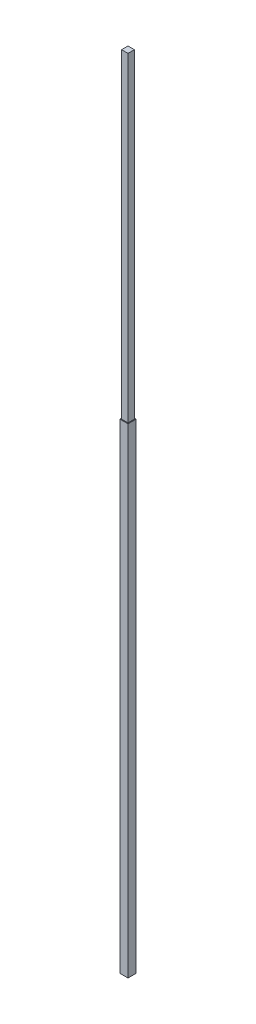
ISO-10303-21;
HEADER;
FILE_DESCRIPTION(('STEP AP214'),'2;1');
FILE_NAME('part.step','',(''),(''),'','','');
FILE_SCHEMA(('AUTOMOTIVE_DESIGN { 1 0 10303 214 1 1 1 1 }'));
ENDSEC;
DATA;
#1=APPLICATION_CONTEXT('core data for automotive mechanical design processes');
#2=APPLICATION_PROTOCOL_DEFINITION('international standard','automotive_design',2000,#1);
#3=PRODUCT_CONTEXT('',#1,'mechanical');
#4=PRODUCT('Part','Part','',(#3));
#5=PRODUCT_RELATED_PRODUCT_CATEGORY('part','',(#4));
#6=PRODUCT_DEFINITION_FORMATION('','',#4);
#7=PRODUCT_DEFINITION_CONTEXT('part definition',#1,'design');
#8=PRODUCT_DEFINITION('design','',#6,#7);
#9=PRODUCT_DEFINITION_SHAPE('','',#8);
#10=(LENGTH_UNIT() NAMED_UNIT(*) SI_UNIT(.MILLI.,.METRE.));
#11=(NAMED_UNIT(*) PLANE_ANGLE_UNIT() SI_UNIT($,.RADIAN.));
#12=(NAMED_UNIT(*) SI_UNIT($,.STERADIAN.) SOLID_ANGLE_UNIT());
#13=UNCERTAINTY_MEASURE_WITH_UNIT(LENGTH_MEASURE(1.E-05),#10,'distance_accuracy_value','');
#14=(GEOMETRIC_REPRESENTATION_CONTEXT(3) GLOBAL_UNCERTAINTY_ASSIGNED_CONTEXT((#13)) GLOBAL_UNIT_ASSIGNED_CONTEXT((#10,
#11,#12)) REPRESENTATION_CONTEXT('',''));
#15=CARTESIAN_POINT('',(0.,0.,0.));
#16=DIRECTION('',(0.,0.,1.));
#17=DIRECTION('',(1.,0.,0.));
#18=AXIS2_PLACEMENT_3D('',#15,#16,#17);
#19=CARTESIAN_POINT('',(22.86,1016.,-22.86));
#20=DIRECTION('',(0.,0.,1.));
#21=DIRECTION('',(1.,0.,0.));
#22=AXIS2_PLACEMENT_3D('',#19,#20,#21);
#23=PLANE('',#22);
#24=DIRECTION('',(-1.,0.,0.));
#25=VECTOR('',#24,1.);
#26=CARTESIAN_POINT('',(22.86,0.,-22.86));
#27=LINE('',#26,#25);
#28=CARTESIAN_POINT('',(22.86,0.,-22.86));
#29=VERTEX_POINT('',#28);
#30=CARTESIAN_POINT('',(2.54,0.,-22.86));
#31=VERTEX_POINT('',#30);
#32=EDGE_CURVE('E111',#29,#31,#27,.T.);
#33=ORIENTED_EDGE('',*,*,#32,.T.);
#34=DIRECTION('',(0.,-1.,0.));
#35=VECTOR('',#34,1.);
#36=CARTESIAN_POINT('',(2.54,1016.,-22.86));
#37=LINE('',#36,#35);
#38=CARTESIAN_POINT('',(2.54,1016.,-22.86));
#39=VERTEX_POINT('',#38);
#40=EDGE_CURVE('E12',#39,#31,#37,.T.);
#41=ORIENTED_EDGE('',*,*,#40,.F.);
#42=DIRECTION('',(-1.,0.,0.));
#43=VECTOR('',#42,1.);
#44=CARTESIAN_POINT('',(22.86,1016.,-22.86));
#45=LINE('',#44,#43);
#46=CARTESIAN_POINT('',(22.86,1016.,-22.86));
#47=VERTEX_POINT('',#46);
#48=EDGE_CURVE('E99',#47,#39,#45,.T.);
#49=ORIENTED_EDGE('',*,*,#48,.F.);
#50=DIRECTION('',(0.,-1.,0.));
#51=VECTOR('',#50,1.);
#52=CARTESIAN_POINT('',(22.86,1016.,-22.86));
#53=LINE('',#52,#51);
#54=EDGE_CURVE('E107',#47,#29,#53,.T.);
#55=ORIENTED_EDGE('',*,*,#54,.T.);
#56=EDGE_LOOP('',(#33,#41,#49,#55));
#57=FACE_BOUND('',#56,.T.);
#58=ADVANCED_FACE('F48',(#57),#23,.F.);
#59=CARTESIAN_POINT('',(2.54,1016.,-22.86));
#60=DIRECTION('',(1.,0.,0.));
#61=DIRECTION('',(0.,0.,-1.));
#62=AXIS2_PLACEMENT_3D('',#59,#60,#61);
#63=PLANE('',#62);
#64=DIRECTION('',(0.,0.,1.));
#65=VECTOR('',#64,1.);
#66=CARTESIAN_POINT('',(2.54,0.,-22.86));
#67=LINE('',#66,#65);
#68=CARTESIAN_POINT('',(2.54,0.,-2.54));
#69=VERTEX_POINT('',#68);
#70=EDGE_CURVE('E103',#31,#69,#67,.T.);
#71=ORIENTED_EDGE('',*,*,#70,.T.);
#72=DIRECTION('',(0.,-1.,0.));
#73=VECTOR('',#72,1.);
#74=CARTESIAN_POINT('',(2.54,1016.,-2.54));
#75=LINE('',#74,#73);
#76=CARTESIAN_POINT('',(2.54,1016.,-2.54));
#77=VERTEX_POINT('',#76);
#78=EDGE_CURVE('E56',#77,#69,#75,.T.);
#79=ORIENTED_EDGE('',*,*,#78,.F.);
#80=DIRECTION('',(0.,0.,1.));
#81=VECTOR('',#80,1.);
#82=CARTESIAN_POINT('',(2.54,1016.,-22.86));
#83=LINE('',#82,#81);
#84=EDGE_CURVE('E94',#39,#77,#83,.T.);
#85=ORIENTED_EDGE('',*,*,#84,.F.);
#86=ORIENTED_EDGE('',*,*,#40,.T.);
#87=EDGE_LOOP('',(#71,#79,#85,#86));
#88=FACE_BOUND('',#87,.T.);
#89=ADVANCED_FACE('F102',(#88),#63,.F.);
#90=CARTESIAN_POINT('',(2.54,1016.,-2.54));
#91=DIRECTION('',(0.,0.,-1.));
#92=DIRECTION('',(-1.,0.,0.));
#93=AXIS2_PLACEMENT_3D('',#90,#91,#92);
#94=PLANE('',#93);
#95=DIRECTION('',(1.,0.,0.));
#96=VECTOR('',#95,1.);
#97=CARTESIAN_POINT('',(2.54,0.,-2.54));
#98=LINE('',#97,#96);
#99=CARTESIAN_POINT('',(22.86,0.,-2.54));
#100=VERTEX_POINT('',#99);
#101=EDGE_CURVE('E81',#69,#100,#98,.T.);
#102=ORIENTED_EDGE('',*,*,#101,.T.);
#103=DIRECTION('',(0.,-1.,0.));
#104=VECTOR('',#103,1.);
#105=CARTESIAN_POINT('',(22.86,1016.,-2.54));
#106=LINE('',#105,#104);
#107=CARTESIAN_POINT('',(22.86,1016.,-2.54));
#108=VERTEX_POINT('',#107);
#109=EDGE_CURVE('E104',#108,#100,#106,.T.);
#110=ORIENTED_EDGE('',*,*,#109,.F.);
#111=DIRECTION('',(1.,0.,0.));
#112=VECTOR('',#111,1.);
#113=CARTESIAN_POINT('',(2.54,1016.,-2.54));
#114=LINE('',#113,#112);
#115=EDGE_CURVE('E97',#77,#108,#114,.T.);
#116=ORIENTED_EDGE('',*,*,#115,.F.);
#117=ORIENTED_EDGE('',*,*,#78,.T.);
#118=EDGE_LOOP('',(#102,#110,#116,#117));
#119=FACE_BOUND('',#118,.T.);
#120=ADVANCED_FACE('F105',(#119),#94,.F.);
#121=CARTESIAN_POINT('',(22.86,1016.,-2.54));
#122=DIRECTION('',(-1.,0.,0.));
#123=DIRECTION('',(0.,0.,1.));
#124=AXIS2_PLACEMENT_3D('',#121,#122,#123);
#125=PLANE('',#124);
#126=DIRECTION('',(0.,0.,-1.));
#127=VECTOR('',#126,1.);
#128=CARTESIAN_POINT('',(22.86,0.,-2.54));
#129=LINE('',#128,#127);
#130=EDGE_CURVE('E87',#100,#29,#129,.T.);
#131=ORIENTED_EDGE('',*,*,#130,.T.);
#132=ORIENTED_EDGE('',*,*,#54,.F.);
#133=DIRECTION('',(0.,0.,-1.));
#134=VECTOR('',#133,1.);
#135=CARTESIAN_POINT('',(22.86,1016.,-2.54));
#136=LINE('',#135,#134);
#137=EDGE_CURVE('E64',#108,#47,#136,.T.);
#138=ORIENTED_EDGE('',*,*,#137,.F.);
#139=ORIENTED_EDGE('',*,*,#109,.T.);
#140=EDGE_LOOP('',(#131,#132,#138,#139));
#141=FACE_BOUND('',#140,.T.);
#142=ADVANCED_FACE('F118',(#141),#125,.F.);
#143=CARTESIAN_POINT('',(2.54,1016.,-22.86));
#144=DIRECTION('',(0.,1.,0.));
#145=DIRECTION('',(0.,0.,1.));
#146=AXIS2_PLACEMENT_3D('',#143,#144,#145);
#147=PLANE('',#146);
#148=ORIENTED_EDGE('',*,*,#48,.T.);
#149=ORIENTED_EDGE('',*,*,#84,.T.);
#150=ORIENTED_EDGE('',*,*,#115,.T.);
#151=ORIENTED_EDGE('',*,*,#137,.T.);
#152=EDGE_LOOP('',(#148,#149,#150,#151));
#153=FACE_BOUND('',#152,.T.);
#154=ADVANCED_FACE('F95',(#153),#147,.T.);
#155=CARTESIAN_POINT('',(2.54,0.,-22.86));
#156=DIRECTION('',(0.,1.,0.));
#157=DIRECTION('',(0.,0.,1.));
#158=AXIS2_PLACEMENT_3D('',#155,#156,#157);
#159=PLANE('',#158);
#160=ORIENTED_EDGE('',*,*,#32,.F.);
#161=ORIENTED_EDGE('',*,*,#130,.F.);
#162=ORIENTED_EDGE('',*,*,#101,.F.);
#163=ORIENTED_EDGE('',*,*,#70,.F.);
#164=EDGE_LOOP('',(#160,#161,#162,#163));
#165=FACE_BOUND('',#164,.T.);
#166=ADVANCED_FACE('F121',(#165),#159,.F.);
#167=CLOSED_SHELL('',(#58,#89,#120,#142,#154,#166));
#168=MANIFOLD_SOLID_BREP('B2',#167);
#169=CARTESIAN_POINT('',(0.,-1524.,0.));
#170=DIRECTION('',(-1.,0.,0.));
#171=DIRECTION('',(0.,0.,1.));
#172=AXIS2_PLACEMENT_3D('',#169,#170,#171);
#173=PLANE('',#172);
#174=DIRECTION('',(0.,0.,1.));
#175=VECTOR('',#174,1.);
#176=CARTESIAN_POINT('',(0.,0.,0.));
#177=LINE('',#176,#175);
#178=CARTESIAN_POINT('',(0.,0.,-25.4));
#179=VERTEX_POINT('',#178);
#180=CARTESIAN_POINT('',(0.,0.,0.));
#181=VERTEX_POINT('',#180);
#182=EDGE_CURVE('E235',#179,#181,#177,.T.);
#183=ORIENTED_EDGE('',*,*,#182,.F.);
#184=DIRECTION('',(0.,1.,0.));
#185=VECTOR('',#184,1.);
#186=CARTESIAN_POINT('',(0.,-1524.,-25.4));
#187=LINE('',#186,#185);
#188=CARTESIAN_POINT('',(0.,-1524.,-25.4));
#189=VERTEX_POINT('',#188);
#190=EDGE_CURVE('E46',#189,#179,#187,.T.);
#191=ORIENTED_EDGE('',*,*,#190,.F.);
#192=DIRECTION('',(0.,0.,1.));
#193=VECTOR('',#192,1.);
#194=CARTESIAN_POINT('',(0.,-1524.,0.));
#195=LINE('',#194,#193);
#196=CARTESIAN_POINT('',(0.,-1524.,0.));
#197=VERTEX_POINT('',#196);
#198=EDGE_CURVE('E229',#189,#197,#195,.T.);
#199=ORIENTED_EDGE('',*,*,#198,.T.);
#200=DIRECTION('',(0.,1.,0.));
#201=VECTOR('',#200,1.);
#202=CARTESIAN_POINT('',(0.,-1524.,0.));
#203=LINE('',#202,#201);
#204=EDGE_CURVE('E174',#197,#181,#203,.T.);
#205=ORIENTED_EDGE('',*,*,#204,.T.);
#206=EDGE_LOOP('',(#183,#191,#199,#205));
#207=FACE_BOUND('',#206,.T.);
#208=ADVANCED_FACE('F171',(#207),#173,.T.);
#209=CARTESIAN_POINT('',(0.,-1524.,-25.4));
#210=DIRECTION('',(0.,0.,-1.));
#211=DIRECTION('',(-1.,0.,0.));
#212=AXIS2_PLACEMENT_3D('',#209,#210,#211);
#213=PLANE('',#212);
#214=DIRECTION('',(-1.,0.,0.));
#215=VECTOR('',#214,1.);
#216=CARTESIAN_POINT('',(0.,0.,-25.4));
#217=LINE('',#216,#215);
#218=CARTESIAN_POINT('',(25.4,0.,-25.4));
#219=VERTEX_POINT('',#218);
#220=EDGE_CURVE('E231',#219,#179,#217,.T.);
#221=ORIENTED_EDGE('',*,*,#220,.F.);
#222=DIRECTION('',(0.,1.,0.));
#223=VECTOR('',#222,1.);
#224=CARTESIAN_POINT('',(25.4,-1524.,-25.4));
#225=LINE('',#224,#223);
#226=CARTESIAN_POINT('',(25.4,-1524.,-25.4));
#227=VERTEX_POINT('',#226);
#228=EDGE_CURVE('E180',#227,#219,#225,.T.);
#229=ORIENTED_EDGE('',*,*,#228,.F.);
#230=DIRECTION('',(-1.,0.,0.));
#231=VECTOR('',#230,1.);
#232=CARTESIAN_POINT('',(0.,-1524.,-25.4));
#233=LINE('',#232,#231);
#234=EDGE_CURVE('E226',#227,#189,#233,.T.);
#235=ORIENTED_EDGE('',*,*,#234,.T.);
#236=ORIENTED_EDGE('',*,*,#190,.T.);
#237=EDGE_LOOP('',(#221,#229,#235,#236));
#238=FACE_BOUND('',#237,.T.);
#239=ADVANCED_FACE('F245',(#238),#213,.T.);
#240=CARTESIAN_POINT('',(25.4,-1524.,0.));
#241=DIRECTION('',(1.,0.,0.));
#242=DIRECTION('',(0.,0.,-1.));
#243=AXIS2_PLACEMENT_3D('',#240,#241,#242);
#244=PLANE('',#243);
#245=DIRECTION('',(0.,0.,-1.));
#246=VECTOR('',#245,1.);
#247=CARTESIAN_POINT('',(25.4,0.,0.));
#248=LINE('',#247,#246);
#249=CARTESIAN_POINT('',(25.4,0.,0.));
#250=VERTEX_POINT('',#249);
#251=EDGE_CURVE('E221',#250,#219,#248,.T.);
#252=ORIENTED_EDGE('',*,*,#251,.F.);
#253=DIRECTION('',(0.,1.,0.));
#254=VECTOR('',#253,1.);
#255=CARTESIAN_POINT('',(25.4,-1524.,0.));
#256=LINE('',#255,#254);
#257=CARTESIAN_POINT('',(25.4,-1524.,0.));
#258=VERTEX_POINT('',#257);
#259=EDGE_CURVE('E216',#258,#250,#256,.T.);
#260=ORIENTED_EDGE('',*,*,#259,.F.);
#261=DIRECTION('',(0.,0.,-1.));
#262=VECTOR('',#261,1.);
#263=CARTESIAN_POINT('',(25.4,-1524.,0.));
#264=LINE('',#263,#262);
#265=EDGE_CURVE('E219',#258,#227,#264,.T.);
#266=ORIENTED_EDGE('',*,*,#265,.T.);
#267=ORIENTED_EDGE('',*,*,#228,.T.);
#268=EDGE_LOOP('',(#252,#260,#266,#267));
#269=FACE_BOUND('',#268,.T.);
#270=ADVANCED_FACE('F218',(#269),#244,.T.);
#271=CARTESIAN_POINT('',(0.,-1524.,0.));
#272=DIRECTION('',(0.,0.,1.));
#273=DIRECTION('',(1.,0.,0.));
#274=AXIS2_PLACEMENT_3D('',#271,#272,#273);
#275=PLANE('',#274);
#276=DIRECTION('',(1.,0.,0.));
#277=VECTOR('',#276,1.);
#278=CARTESIAN_POINT('',(0.,0.,0.));
#279=LINE('',#278,#277);
#280=EDGE_CURVE('E238',#181,#250,#279,.T.);
#281=ORIENTED_EDGE('',*,*,#280,.F.);
#282=ORIENTED_EDGE('',*,*,#204,.F.);
#283=DIRECTION('',(1.,0.,0.));
#284=VECTOR('',#283,1.);
#285=CARTESIAN_POINT('',(0.,-1524.,0.));
#286=LINE('',#285,#284);
#287=EDGE_CURVE('E225',#197,#258,#286,.T.);
#288=ORIENTED_EDGE('',*,*,#287,.T.);
#289=ORIENTED_EDGE('',*,*,#259,.T.);
#290=EDGE_LOOP('',(#281,#282,#288,#289));
#291=FACE_BOUND('',#290,.T.);
#292=ADVANCED_FACE('F228',(#291),#275,.T.);
#293=CARTESIAN_POINT('',(0.,-1524.,-25.4));
#294=DIRECTION('',(0.,-1.,0.));
#295=DIRECTION('',(0.,0.,-1.));
#296=AXIS2_PLACEMENT_3D('',#293,#294,#295);
#297=PLANE('',#296);
#298=ORIENTED_EDGE('',*,*,#198,.F.);
#299=ORIENTED_EDGE('',*,*,#234,.F.);
#300=ORIENTED_EDGE('',*,*,#265,.F.);
#301=ORIENTED_EDGE('',*,*,#287,.F.);
#302=EDGE_LOOP('',(#298,#299,#300,#301));
#303=FACE_BOUND('',#302,.T.);
#304=ADVANCED_FACE('F224',(#303),#297,.T.);
#305=CARTESIAN_POINT('',(0.,0.,-25.4));
#306=DIRECTION('',(0.,-1.,0.));
#307=DIRECTION('',(0.,0.,-1.));
#308=AXIS2_PLACEMENT_3D('',#305,#306,#307);
#309=PLANE('',#308);
#310=ORIENTED_EDGE('',*,*,#182,.T.);
#311=ORIENTED_EDGE('',*,*,#280,.T.);
#312=ORIENTED_EDGE('',*,*,#251,.T.);
#313=ORIENTED_EDGE('',*,*,#220,.T.);
#314=EDGE_LOOP('',(#310,#311,#312,#313));
#315=FACE_BOUND('',#314,.T.);
#316=ADVANCED_FACE('F244',(#315),#309,.F.);
#317=CLOSED_SHELL('',(#208,#239,#270,#292,#304,#316));
#318=MANIFOLD_SOLID_BREP('B6',#317);
#319=ADVANCED_BREP_SHAPE_REPRESENTATION('',(#18,#168,#318),#14);
#320=SHAPE_DEFINITION_REPRESENTATION(#9,#319);
ENDSEC;
END-ISO-10303-21;
